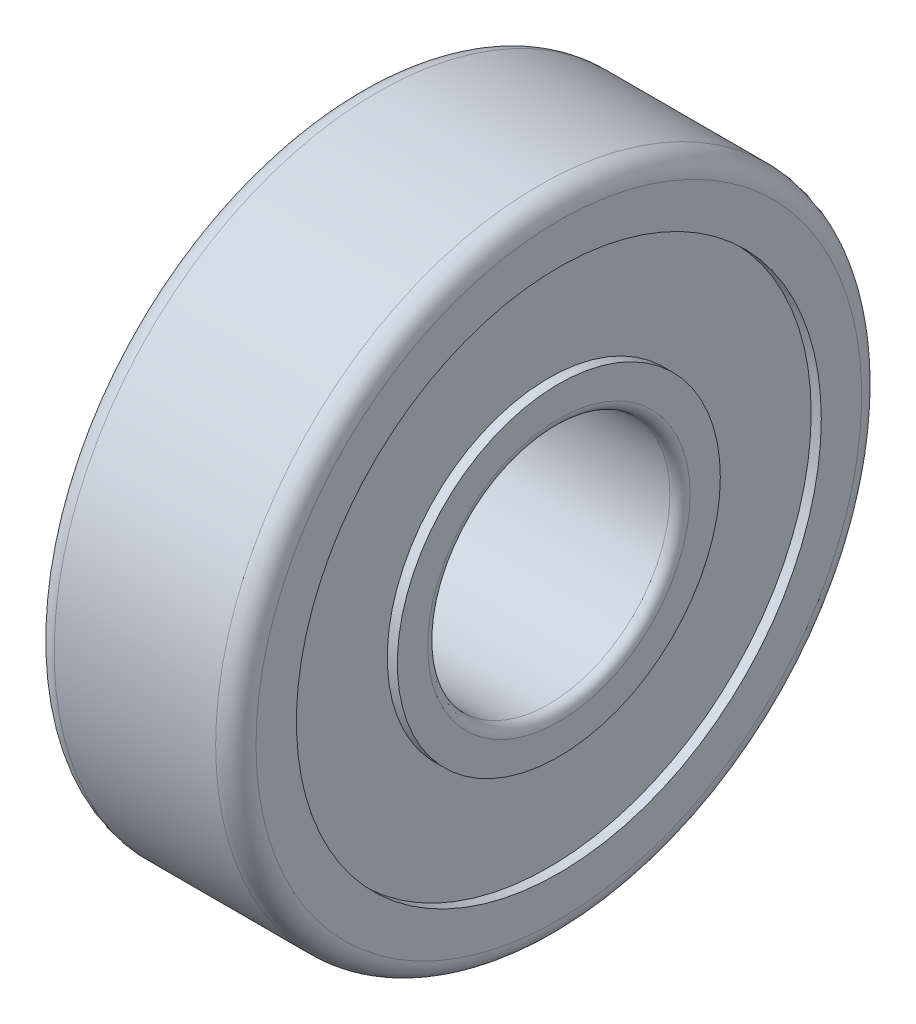
ISO-10303-21;
HEADER;
FILE_DESCRIPTION(('STEP AP214'),'2;1');
FILE_NAME('part.step','',(''),(''),'','','');
FILE_SCHEMA(('AUTOMOTIVE_DESIGN { 1 0 10303 214 1 1 1 1 }'));
ENDSEC;
DATA;
#1=APPLICATION_CONTEXT('core data for automotive mechanical design processes');
#2=APPLICATION_PROTOCOL_DEFINITION('international standard','automotive_design',2000,#1);
#3=PRODUCT_CONTEXT('',#1,'mechanical');
#4=PRODUCT('Part','Part','',(#3));
#5=PRODUCT_RELATED_PRODUCT_CATEGORY('part','',(#4));
#6=PRODUCT_DEFINITION_FORMATION('','',#4);
#7=PRODUCT_DEFINITION_CONTEXT('part definition',#1,'design');
#8=PRODUCT_DEFINITION('design','',#6,#7);
#9=PRODUCT_DEFINITION_SHAPE('','',#8);
#10=(LENGTH_UNIT() NAMED_UNIT(*) SI_UNIT(.MILLI.,.METRE.));
#11=(NAMED_UNIT(*) PLANE_ANGLE_UNIT() SI_UNIT($,.RADIAN.));
#12=(NAMED_UNIT(*) SI_UNIT($,.STERADIAN.) SOLID_ANGLE_UNIT());
#13=UNCERTAINTY_MEASURE_WITH_UNIT(LENGTH_MEASURE(1.E-05),#10,'distance_accuracy_value','');
#14=(GEOMETRIC_REPRESENTATION_CONTEXT(3) GLOBAL_UNCERTAINTY_ASSIGNED_CONTEXT((#13)) GLOBAL_UNIT_ASSIGNED_CONTEXT((#10,
#11,#12)) REPRESENTATION_CONTEXT('',''));
#15=CARTESIAN_POINT('',(0.,0.,0.));
#16=DIRECTION('',(0.,0.,1.));
#17=DIRECTION('',(1.,0.,0.));
#18=AXIS2_PLACEMENT_3D('',#15,#16,#17);
#19=CARTESIAN_POINT('',(3.5,0.,0.));
#20=DIRECTION('',(-1.,0.,0.));
#21=DIRECTION('',(0.,0.,1.));
#22=AXIS2_PLACEMENT_3D('',#19,#20,#21);
#23=CYLINDRICAL_SURFACE('',#22,8.);
#24=CARTESIAN_POINT('',(5.5,0.,0.));
#25=DIRECTION('',(-1.,0.,0.));
#26=DIRECTION('',(0.,0.,1.));
#27=AXIS2_PLACEMENT_3D('',#24,#25,#26);
#28=CIRCLE('',#27,8.);
#29=CARTESIAN_POINT('',(5.5,0.,-8.));
#30=VERTEX_POINT('',#29);
#31=EDGE_CURVE('P0_E54',#30,#30,#28,.T.);
#32=ORIENTED_EDGE('',*,*,#31,.F.);
#33=DIRECTION('',(-1.,0.,0.));
#34=VECTOR('',#33,1.);
#35=CARTESIAN_POINT('',(3.5,0.,-8.));
#36=LINE('',#35,#34);
#37=CARTESIAN_POINT('',(-3.5,0.,-8.));
#38=VERTEX_POINT('',#37);
#39=EDGE_CURVE('P0_E11',#30,#38,#36,.T.);
#40=ORIENTED_EDGE('',*,*,#39,.T.);
#41=CARTESIAN_POINT('',(-3.5,0.,0.));
#42=DIRECTION('',(-1.,0.,0.));
#43=DIRECTION('',(0.,0.,1.));
#44=AXIS2_PLACEMENT_3D('',#41,#42,#43);
#45=CIRCLE('',#44,8.);
#46=EDGE_CURVE('P0_E26',#38,#38,#45,.T.);
#47=ORIENTED_EDGE('',*,*,#46,.T.);
#48=ORIENTED_EDGE('',*,*,#39,.F.);
#49=EDGE_LOOP('',(#32,#40,#47,#48));
#50=FACE_BOUND('',#49,.T.);
#51=ADVANCED_FACE('P0_F16',(#50),#23,.F.);
#52=CARTESIAN_POINT('',(-3.5,0.,0.));
#53=DIRECTION('',(-1.,0.,0.));
#54=DIRECTION('',(0.,0.,1.));
#55=AXIS2_PLACEMENT_3D('',#52,#53,#54);
#56=PLANE('',#55);
#57=ORIENTED_EDGE('',*,*,#46,.F.);
#58=EDGE_LOOP('',(#57));
#59=FACE_BOUND('',#58,.T.);
#60=CARTESIAN_POINT('',(-3.5,0.,0.));
#61=DIRECTION('',(-1.,0.,0.));
#62=DIRECTION('',(0.,0.,1.));
#63=AXIS2_PLACEMENT_3D('',#60,#61,#62);
#64=CIRCLE('',#63,13.);
#65=CARTESIAN_POINT('',(-3.5,0.,-13.));
#66=VERTEX_POINT('',#65);
#67=EDGE_CURVE('P0_E61',#66,#66,#64,.T.);
#68=ORIENTED_EDGE('',*,*,#67,.T.);
#69=EDGE_LOOP('',(#68));
#70=FACE_BOUND('',#69,.T.);
#71=ADVANCED_FACE('P0_F67',(#59,#70),#56,.T.);
#72=CARTESIAN_POINT('',(5.5,0.,0.));
#73=DIRECTION('',(-1.,0.,0.));
#74=DIRECTION('',(0.,0.,1.));
#75=AXIS2_PLACEMENT_3D('',#72,#73,#74);
#76=PLANE('',#75);
#77=ORIENTED_EDGE('',*,*,#31,.T.);
#78=EDGE_LOOP('',(#77));
#79=FACE_BOUND('',#78,.T.);
#80=CARTESIAN_POINT('',(5.5,0.,0.));
#81=DIRECTION('',(-1.,0.,0.));
#82=DIRECTION('',(0.,0.,1.));
#83=AXIS2_PLACEMENT_3D('',#80,#81,#82);
#84=CIRCLE('',#83,13.);
#85=CARTESIAN_POINT('',(5.5,0.,-13.));
#86=VERTEX_POINT('',#85);
#87=EDGE_CURVE('P0_E48',#86,#86,#84,.T.);
#88=ORIENTED_EDGE('',*,*,#87,.F.);
#89=EDGE_LOOP('',(#88));
#90=FACE_BOUND('',#89,.T.);
#91=ADVANCED_FACE('P0_F69',(#79,#90),#76,.F.);
#92=CARTESIAN_POINT('',(3.5,0.,0.));
#93=DIRECTION('',(-1.,0.,0.));
#94=DIRECTION('',(0.,0.,1.));
#95=AXIS2_PLACEMENT_3D('',#92,#93,#94);
#96=CYLINDRICAL_SURFACE('',#95,13.);
#97=ORIENTED_EDGE('',*,*,#67,.F.);
#98=DIRECTION('',(1.,0.,0.));
#99=VECTOR('',#98,1.);
#100=CARTESIAN_POINT('',(3.5,0.,-13.));
#101=LINE('',#100,#99);
#102=EDGE_CURVE('P0_E50',#66,#86,#101,.T.);
#103=ORIENTED_EDGE('',*,*,#102,.T.);
#104=ORIENTED_EDGE('',*,*,#87,.T.);
#105=ORIENTED_EDGE('',*,*,#102,.F.);
#106=EDGE_LOOP('',(#97,#103,#104,#105));
#107=FACE_BOUND('',#106,.T.);
#108=ADVANCED_FACE('P0_F18',(#107),#96,.T.);
#109=CLOSED_SHELL('',(#51,#71,#91,#108));
#110=MANIFOLD_SOLID_BREP('P0_B1',#109);
#111=CARTESIAN_POINT('',(4.,0.,0.));
#112=DIRECTION('',(-1.,0.,0.));
#113=DIRECTION('',(0.,0.,1.));
#114=AXIS2_PLACEMENT_3D('',#111,#112,#113);
#115=CYLINDRICAL_SURFACE('',#114,13.);
#116=CARTESIAN_POINT('',(6.,0.,0.));
#117=DIRECTION('',(1.,0.,0.));
#118=DIRECTION('',(0.,0.,1.));
#119=AXIS2_PLACEMENT_3D('',#116,#117,#118);
#120=CIRCLE('',#119,13.);
#121=CARTESIAN_POINT('',(6.,0.,-13.));
#122=VERTEX_POINT('',#121);
#123=EDGE_CURVE('P1_E88',#122,#122,#120,.T.);
#124=ORIENTED_EDGE('',*,*,#123,.T.);
#125=DIRECTION('',(-1.,0.,0.));
#126=VECTOR('',#125,1.);
#127=CARTESIAN_POINT('',(4.,0.,-13.));
#128=LINE('',#127,#126);
#129=CARTESIAN_POINT('',(-4.,0.,-13.));
#130=VERTEX_POINT('',#129);
#131=EDGE_CURVE('P1_E11',#122,#130,#128,.T.);
#132=ORIENTED_EDGE('',*,*,#131,.T.);
#133=CARTESIAN_POINT('',(-4.,0.,0.));
#134=DIRECTION('',(1.,0.,0.));
#135=DIRECTION('',(0.,0.,1.));
#136=AXIS2_PLACEMENT_3D('',#133,#134,#135);
#137=CIRCLE('',#136,13.);
#138=EDGE_CURVE('P1_E26',#130,#130,#137,.T.);
#139=ORIENTED_EDGE('',*,*,#138,.F.);
#140=ORIENTED_EDGE('',*,*,#131,.F.);
#141=EDGE_LOOP('',(#124,#132,#139,#140));
#142=FACE_BOUND('',#141,.T.);
#143=ADVANCED_FACE('P1_F16',(#142),#115,.F.);
#144=CARTESIAN_POINT('',(-4.,0.,0.));
#145=DIRECTION('',(1.,0.,0.));
#146=DIRECTION('',(0.,1.,0.));
#147=AXIS2_PLACEMENT_3D('',#144,#145,#146);
#148=PLANE('',#147);
#149=ORIENTED_EDGE('',*,*,#138,.T.);
#150=EDGE_LOOP('',(#149));
#151=FACE_BOUND('',#150,.T.);
#152=CARTESIAN_POINT('',(-4.,0.,0.));
#153=DIRECTION('',(1.,0.,0.));
#154=DIRECTION('',(0.,0.,1.));
#155=AXIS2_PLACEMENT_3D('',#152,#153,#154);
#156=CIRCLE('',#155,15.);
#157=CARTESIAN_POINT('',(-4.,0.,-15.));
#158=VERTEX_POINT('',#157);
#159=EDGE_CURVE('P1_E86',#158,#158,#156,.T.);
#160=ORIENTED_EDGE('',*,*,#159,.F.);
#161=EDGE_LOOP('',(#160));
#162=FACE_BOUND('',#161,.T.);
#163=ADVANCED_FACE('P1_F117',(#151,#162),#148,.F.);
#164=CARTESIAN_POINT('',(-3.,0.,0.));
#165=DIRECTION('',(-1.,0.,0.));
#166=DIRECTION('',(0.,0.,1.));
#167=AXIS2_PLACEMENT_3D('',#164,#165,#166);
#168=TOROIDAL_SURFACE('',#167,15.,1.);
#169=ORIENTED_EDGE('',*,*,#159,.T.);
#170=CARTESIAN_POINT('',(-3.,0.,-15.));
#171=DIRECTION('',(0.,-1.,0.));
#172=DIRECTION('',(0.,0.,-1.));
#173=AXIS2_PLACEMENT_3D('',#170,#171,#172);
#174=CIRCLE('',#173,1.);
#175=CARTESIAN_POINT('',(-3.,0.,-16.));
#176=VERTEX_POINT('',#175);
#177=EDGE_CURVE('P1_E47',#158,#176,#174,.T.);
#178=ORIENTED_EDGE('',*,*,#177,.T.);
#179=CARTESIAN_POINT('',(-3.,0.,0.));
#180=DIRECTION('',(-1.,0.,0.));
#181=DIRECTION('',(0.,0.,1.));
#182=AXIS2_PLACEMENT_3D('',#179,#180,#181);
#183=CIRCLE('',#182,16.);
#184=EDGE_CURVE('P1_E95',#176,#176,#183,.T.);
#185=ORIENTED_EDGE('',*,*,#184,.T.);
#186=ORIENTED_EDGE('',*,*,#177,.F.);
#187=EDGE_LOOP('',(#169,#178,#185,#186));
#188=FACE_BOUND('',#187,.T.);
#189=ADVANCED_FACE('P1_F103',(#188),#168,.T.);
#190=CARTESIAN_POINT('',(6.,0.,0.));
#191=DIRECTION('',(1.,0.,0.));
#192=DIRECTION('',(0.,1.,0.));
#193=AXIS2_PLACEMENT_3D('',#190,#191,#192);
#194=PLANE('',#193);
#195=ORIENTED_EDGE('',*,*,#123,.F.);
#196=EDGE_LOOP('',(#195));
#197=FACE_BOUND('',#196,.T.);
#198=CARTESIAN_POINT('',(6.,0.,0.));
#199=DIRECTION('',(-1.,0.,0.));
#200=DIRECTION('',(0.,0.,1.));
#201=AXIS2_PLACEMENT_3D('',#198,#199,#200);
#202=CIRCLE('',#201,15.);
#203=CARTESIAN_POINT('',(6.,0.,15.));
#204=VERTEX_POINT('',#203);
#205=EDGE_CURVE('P1_E72',#204,#204,#202,.T.);
#206=ORIENTED_EDGE('',*,*,#205,.F.);
#207=EDGE_LOOP('',(#206));
#208=FACE_BOUND('',#207,.T.);
#209=ADVANCED_FACE('P1_F107',(#197,#208),#194,.T.);
#210=CARTESIAN_POINT('',(4.,0.,0.));
#211=DIRECTION('',(-1.,0.,0.));
#212=DIRECTION('',(0.,0.,1.));
#213=AXIS2_PLACEMENT_3D('',#210,#211,#212);
#214=CYLINDRICAL_SURFACE('',#213,16.);
#215=ORIENTED_EDGE('',*,*,#184,.F.);
#216=DIRECTION('',(1.,0.,0.));
#217=VECTOR('',#216,1.);
#218=CARTESIAN_POINT('',(4.,0.,-16.));
#219=LINE('',#218,#217);
#220=CARTESIAN_POINT('',(5.,0.,-16.));
#221=VERTEX_POINT('',#220);
#222=EDGE_CURVE('P1_E93',#176,#221,#219,.T.);
#223=ORIENTED_EDGE('',*,*,#222,.T.);
#224=CARTESIAN_POINT('',(5.,0.,0.));
#225=DIRECTION('',(1.,0.,0.));
#226=DIRECTION('',(0.,0.,1.));
#227=AXIS2_PLACEMENT_3D('',#224,#225,#226);
#228=CIRCLE('',#227,16.);
#229=CARTESIAN_POINT('',(5.,0.,16.));
#230=VERTEX_POINT('',#229);
#231=EDGE_CURVE('P1_E20',#230,#221,#228,.T.);
#232=ORIENTED_EDGE('',*,*,#231,.F.);
#233=CARTESIAN_POINT('',(5.,0.,0.));
#234=DIRECTION('',(1.,0.,0.));
#235=DIRECTION('',(0.,0.,1.));
#236=AXIS2_PLACEMENT_3D('',#233,#234,#235);
#237=CIRCLE('',#236,16.);
#238=EDGE_CURVE('P1_E75',#221,#230,#237,.T.);
#239=ORIENTED_EDGE('',*,*,#238,.F.);
#240=ORIENTED_EDGE('',*,*,#222,.F.);
#241=EDGE_LOOP('',(#215,#223,#232,#239,#240));
#242=FACE_BOUND('',#241,.T.);
#243=ADVANCED_FACE('P1_F18',(#242),#214,.T.);
#244=CARTESIAN_POINT('',(5.,0.,0.));
#245=DIRECTION('',(1.,0.,0.));
#246=DIRECTION('',(0.,0.,-1.));
#247=AXIS2_PLACEMENT_3D('',#244,#245,#246);
#248=TOROIDAL_SURFACE('',#247,15.,1.);
#249=ORIENTED_EDGE('',*,*,#205,.T.);
#250=CARTESIAN_POINT('',(5.,0.,15.));
#251=DIRECTION('',(0.,-1.,0.));
#252=DIRECTION('',(0.,0.,1.));
#253=AXIS2_PLACEMENT_3D('',#250,#251,#252);
#254=CIRCLE('',#253,1.);
#255=EDGE_CURVE('P1_E69',#204,#230,#254,.T.);
#256=ORIENTED_EDGE('',*,*,#255,.T.);
#257=ORIENTED_EDGE('',*,*,#231,.T.);
#258=ORIENTED_EDGE('',*,*,#238,.T.);
#259=ORIENTED_EDGE('',*,*,#255,.F.);
#260=EDGE_LOOP('',(#249,#256,#257,#258,#259));
#261=FACE_BOUND('',#260,.T.);
#262=ADVANCED_FACE('P1_F70',(#261),#248,.T.);
#263=CLOSED_SHELL('',(#143,#163,#189,#209,#243,#262));
#264=MANIFOLD_SOLID_BREP('P1_B1',#263);
#265=CARTESIAN_POINT('',(4.,0.,0.));
#266=DIRECTION('',(-1.,0.,0.));
#267=DIRECTION('',(0.,0.,1.));
#268=AXIS2_PLACEMENT_3D('',#265,#266,#267);
#269=CYLINDRICAL_SURFACE('',#268,8.);
#270=CARTESIAN_POINT('',(-4.,0.,0.));
#271=DIRECTION('',(1.,0.,0.));
#272=DIRECTION('',(0.,0.,-1.));
#273=AXIS2_PLACEMENT_3D('',#270,#271,#272);
#274=CIRCLE('',#273,8.);
#275=CARTESIAN_POINT('',(-4.,0.,-8.));
#276=VERTEX_POINT('',#275);
#277=EDGE_CURVE('P2_E25',#276,#276,#274,.T.);
#278=ORIENTED_EDGE('',*,*,#277,.T.);
#279=DIRECTION('',(1.,0.,0.));
#280=VECTOR('',#279,1.);
#281=CARTESIAN_POINT('',(4.,0.,-8.));
#282=LINE('',#281,#280);
#283=CARTESIAN_POINT('',(6.,0.,-8.));
#284=VERTEX_POINT('',#283);
#285=EDGE_CURVE('P2_E11',#276,#284,#282,.T.);
#286=ORIENTED_EDGE('',*,*,#285,.T.);
#287=CARTESIAN_POINT('',(6.,0.,0.));
#288=DIRECTION('',(1.,0.,0.));
#289=DIRECTION('',(0.,0.,1.));
#290=AXIS2_PLACEMENT_3D('',#287,#288,#289);
#291=CIRCLE('',#290,8.);
#292=EDGE_CURVE('P2_E81',#284,#284,#291,.T.);
#293=ORIENTED_EDGE('',*,*,#292,.F.);
#294=ORIENTED_EDGE('',*,*,#285,.F.);
#295=EDGE_LOOP('',(#278,#286,#293,#294));
#296=FACE_BOUND('',#295,.T.);
#297=ADVANCED_FACE('P2_F16',(#296),#269,.T.);
#298=CARTESIAN_POINT('',(-4.,0.,0.));
#299=DIRECTION('',(1.,0.,0.));
#300=DIRECTION('',(0.,1.,0.));
#301=AXIS2_PLACEMENT_3D('',#298,#299,#300);
#302=PLANE('',#301);
#303=CARTESIAN_POINT('',(-4.,0.,0.));
#304=DIRECTION('',(-1.,0.,0.));
#305=DIRECTION('',(0.,0.,1.));
#306=AXIS2_PLACEMENT_3D('',#303,#304,#305);
#307=CIRCLE('',#306,6.5);
#308=CARTESIAN_POINT('',(-4.,0.,-6.5));
#309=VERTEX_POINT('',#308);
#310=EDGE_CURVE('P2_E44',#309,#309,#307,.T.);
#311=ORIENTED_EDGE('',*,*,#310,.F.);
#312=EDGE_LOOP('',(#311));
#313=FACE_BOUND('',#312,.T.);
#314=ORIENTED_EDGE('',*,*,#277,.F.);
#315=EDGE_LOOP('',(#314));
#316=FACE_BOUND('',#315,.T.);
#317=ADVANCED_FACE('P2_F102',(#313,#316),#302,.F.);
#318=CARTESIAN_POINT('',(-3.5,0.,0.));
#319=DIRECTION('',(-1.,0.,0.));
#320=DIRECTION('',(0.,0.,1.));
#321=AXIS2_PLACEMENT_3D('',#318,#319,#320);
#322=TOROIDAL_SURFACE('',#321,6.5,0.5);
#323=CARTESIAN_POINT('',(-3.5,0.,0.));
#324=DIRECTION('',(1.,0.,0.));
#325=DIRECTION('',(0.,0.,1.));
#326=AXIS2_PLACEMENT_3D('',#323,#324,#325);
#327=CIRCLE('',#326,6.);
#328=CARTESIAN_POINT('',(-3.5,0.,-6.));
#329=VERTEX_POINT('',#328);
#330=EDGE_CURVE('P2_E85',#329,#329,#327,.T.);
#331=ORIENTED_EDGE('',*,*,#330,.T.);
#332=CARTESIAN_POINT('',(-3.5,0.,-6.5));
#333=DIRECTION('',(0.,-1.,0.));
#334=DIRECTION('',(0.,0.,-1.));
#335=AXIS2_PLACEMENT_3D('',#332,#333,#334);
#336=CIRCLE('',#335,0.5);
#337=EDGE_CURVE('P2_E83',#329,#309,#336,.T.);
#338=ORIENTED_EDGE('',*,*,#337,.T.);
#339=ORIENTED_EDGE('',*,*,#310,.T.);
#340=ORIENTED_EDGE('',*,*,#337,.F.);
#341=EDGE_LOOP('',(#331,#338,#339,#340));
#342=FACE_BOUND('',#341,.T.);
#343=ADVANCED_FACE('P2_F18',(#342),#322,.T.);
#344=CARTESIAN_POINT('',(6.,0.,0.));
#345=DIRECTION('',(1.,0.,0.));
#346=DIRECTION('',(0.,1.,0.));
#347=AXIS2_PLACEMENT_3D('',#344,#345,#346);
#348=PLANE('',#347);
#349=CARTESIAN_POINT('',(6.,0.,0.));
#350=DIRECTION('',(1.,0.,0.));
#351=DIRECTION('',(0.,0.,1.));
#352=AXIS2_PLACEMENT_3D('',#349,#350,#351);
#353=CIRCLE('',#352,6.5);
#354=CARTESIAN_POINT('',(6.,0.,-6.5));
#355=VERTEX_POINT('',#354);
#356=EDGE_CURVE('P2_E66',#355,#355,#353,.T.);
#357=ORIENTED_EDGE('',*,*,#356,.F.);
#358=EDGE_LOOP('',(#357));
#359=FACE_BOUND('',#358,.T.);
#360=ORIENTED_EDGE('',*,*,#292,.T.);
#361=EDGE_LOOP('',(#360));
#362=FACE_BOUND('',#361,.T.);
#363=ADVANCED_FACE('P2_F101',(#359,#362),#348,.T.);
#364=CARTESIAN_POINT('',(4.,0.,0.));
#365=DIRECTION('',(-1.,0.,0.));
#366=DIRECTION('',(0.,0.,1.));
#367=AXIS2_PLACEMENT_3D('',#364,#365,#366);
#368=CYLINDRICAL_SURFACE('',#367,6.);
#369=CARTESIAN_POINT('',(5.5,0.,0.));
#370=DIRECTION('',(-1.,0.,0.));
#371=DIRECTION('',(0.,0.,1.));
#372=AXIS2_PLACEMENT_3D('',#369,#370,#371);
#373=CIRCLE('',#372,6.);
#374=CARTESIAN_POINT('',(5.5,0.,-6.));
#375=VERTEX_POINT('',#374);
#376=EDGE_CURVE('P2_E68',#375,#375,#373,.T.);
#377=ORIENTED_EDGE('',*,*,#376,.F.);
#378=DIRECTION('',(-1.,0.,0.));
#379=VECTOR('',#378,1.);
#380=CARTESIAN_POINT('',(4.,0.,-6.));
#381=LINE('',#380,#379);
#382=EDGE_CURVE('P2_E75',#375,#329,#381,.T.);
#383=ORIENTED_EDGE('',*,*,#382,.T.);
#384=ORIENTED_EDGE('',*,*,#330,.F.);
#385=ORIENTED_EDGE('',*,*,#382,.F.);
#386=EDGE_LOOP('',(#377,#383,#384,#385));
#387=FACE_BOUND('',#386,.T.);
#388=ADVANCED_FACE('P2_F99',(#387),#368,.F.);
#389=CARTESIAN_POINT('',(5.5,0.,0.));
#390=DIRECTION('',(-1.,0.,0.));
#391=DIRECTION('',(0.,0.,1.));
#392=AXIS2_PLACEMENT_3D('',#389,#390,#391);
#393=TOROIDAL_SURFACE('',#392,6.5,0.5);
#394=ORIENTED_EDGE('',*,*,#356,.T.);
#395=CARTESIAN_POINT('',(5.5,0.,-6.5));
#396=DIRECTION('',(0.,-1.,0.));
#397=DIRECTION('',(0.,0.,-1.));
#398=AXIS2_PLACEMENT_3D('',#395,#396,#397);
#399=CIRCLE('',#398,0.5);
#400=EDGE_CURVE('P2_E63',#355,#375,#399,.T.);
#401=ORIENTED_EDGE('',*,*,#400,.T.);
#402=ORIENTED_EDGE('',*,*,#376,.T.);
#403=ORIENTED_EDGE('',*,*,#400,.F.);
#404=EDGE_LOOP('',(#394,#401,#402,#403));
#405=FACE_BOUND('',#404,.T.);
#406=ADVANCED_FACE('P2_F64',(#405),#393,.T.);
#407=CLOSED_SHELL('',(#297,#317,#343,#363,#388,#406));
#408=MANIFOLD_SOLID_BREP('P2_B1',#407);
#409=ADVANCED_BREP_SHAPE_REPRESENTATION('',(#18,#110,#264,#408),#14);
#410=SHAPE_DEFINITION_REPRESENTATION(#9,#409);
ENDSEC;
END-ISO-10303-21;
